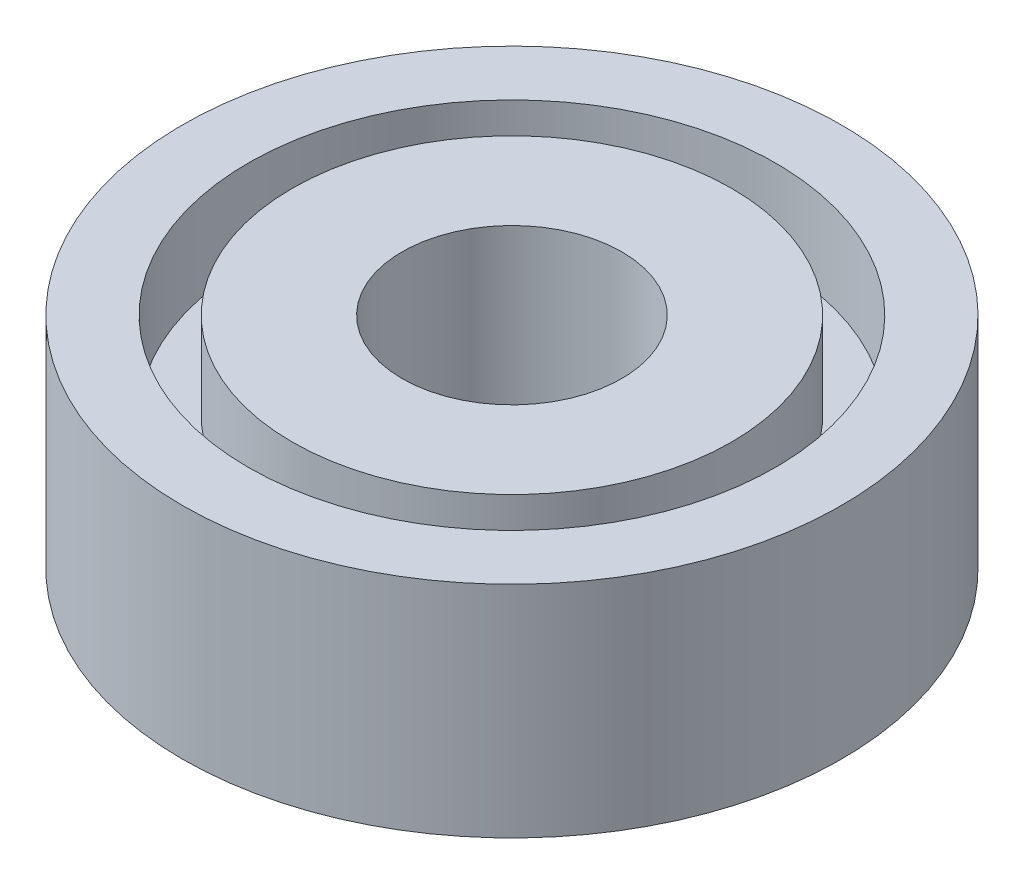
ISO-10303-21;
HEADER;
FILE_DESCRIPTION(('STEP AP214'),'2;1');
FILE_NAME('part.step','',(''),(''),'','','');
FILE_SCHEMA(('AUTOMOTIVE_DESIGN { 1 0 10303 214 1 1 1 1 }'));
ENDSEC;
DATA;
#1=APPLICATION_CONTEXT('core data for automotive mechanical design processes');
#2=APPLICATION_PROTOCOL_DEFINITION('international standard','automotive_design',2000,#1);
#3=PRODUCT_CONTEXT('',#1,'mechanical');
#4=PRODUCT('Part','Part','',(#3));
#5=PRODUCT_RELATED_PRODUCT_CATEGORY('part','',(#4));
#6=PRODUCT_DEFINITION_FORMATION('','',#4);
#7=PRODUCT_DEFINITION_CONTEXT('part definition',#1,'design');
#8=PRODUCT_DEFINITION('design','',#6,#7);
#9=PRODUCT_DEFINITION_SHAPE('','',#8);
#10=(LENGTH_UNIT() NAMED_UNIT(*) SI_UNIT(.MILLI.,.METRE.));
#11=(NAMED_UNIT(*) PLANE_ANGLE_UNIT() SI_UNIT($,.RADIAN.));
#12=(NAMED_UNIT(*) SI_UNIT($,.STERADIAN.) SOLID_ANGLE_UNIT());
#13=UNCERTAINTY_MEASURE_WITH_UNIT(LENGTH_MEASURE(1.E-05),#10,'distance_accuracy_value','');
#14=(GEOMETRIC_REPRESENTATION_CONTEXT(3) GLOBAL_UNCERTAINTY_ASSIGNED_CONTEXT((#13)) GLOBAL_UNIT_ASSIGNED_CONTEXT((#10,
#11,#12)) REPRESENTATION_CONTEXT('',''));
#15=CARTESIAN_POINT('',(0.,0.,0.));
#16=DIRECTION('',(0.,0.,1.));
#17=DIRECTION('',(1.,0.,0.));
#18=AXIS2_PLACEMENT_3D('',#15,#16,#17);
#19=CARTESIAN_POINT('',(0.,1.,0.));
#20=DIRECTION('',(0.,1.,0.));
#21=DIRECTION('',(0.,0.,1.));
#22=AXIS2_PLACEMENT_3D('',#19,#20,#21);
#23=PLANE('',#22);
#24=CARTESIAN_POINT('',(0.,1.,0.));
#25=DIRECTION('',(0.,1.,0.));
#26=DIRECTION('',(0.,0.,1.));
#27=AXIS2_PLACEMENT_3D('',#24,#25,#26);
#28=CIRCLE('',#27,0.5);
#29=CARTESIAN_POINT('',(0.,1.,0.5));
#30=VERTEX_POINT('',#29);
#31=EDGE_CURVE('E68',#30,#30,#28,.T.);
#32=ORIENTED_EDGE('',*,*,#31,.F.);
#33=EDGE_LOOP('',(#32));
#34=FACE_BOUND('',#33,.T.);
#35=CARTESIAN_POINT('',(0.,1.,0.));
#36=DIRECTION('',(0.,1.,0.));
#37=DIRECTION('',(0.,0.,1.));
#38=AXIS2_PLACEMENT_3D('',#35,#36,#37);
#39=CIRCLE('',#38,1.);
#40=CARTESIAN_POINT('',(0.,1.,1.));
#41=VERTEX_POINT('',#40);
#42=EDGE_CURVE('E102',#41,#41,#39,.T.);
#43=ORIENTED_EDGE('',*,*,#42,.T.);
#44=EDGE_LOOP('',(#43));
#45=FACE_BOUND('',#44,.T.);
#46=ADVANCED_FACE('F55',(#34,#45),#23,.T.);
#47=CARTESIAN_POINT('',(0.,0.,0.));
#48=DIRECTION('',(0.,1.,0.));
#49=DIRECTION('',(0.,0.,1.));
#50=AXIS2_PLACEMENT_3D('',#47,#48,#49);
#51=PLANE('',#50);
#52=CARTESIAN_POINT('',(0.,0.,0.));
#53=DIRECTION('',(0.,1.,0.));
#54=DIRECTION('',(0.,0.,1.));
#55=AXIS2_PLACEMENT_3D('',#52,#53,#54);
#56=CIRCLE('',#55,0.5);
#57=CARTESIAN_POINT('',(0.,0.,0.5));
#58=VERTEX_POINT('',#57);
#59=EDGE_CURVE('E70',#58,#58,#56,.T.);
#60=ORIENTED_EDGE('',*,*,#59,.T.);
#61=EDGE_LOOP('',(#60));
#62=FACE_BOUND('',#61,.T.);
#63=CARTESIAN_POINT('',(0.,0.,0.));
#64=DIRECTION('',(0.,1.,0.));
#65=DIRECTION('',(0.,0.,1.));
#66=AXIS2_PLACEMENT_3D('',#63,#64,#65);
#67=CIRCLE('',#66,1.);
#68=CARTESIAN_POINT('',(0.,0.,1.));
#69=VERTEX_POINT('',#68);
#70=EDGE_CURVE('E86',#69,#69,#67,.T.);
#71=ORIENTED_EDGE('',*,*,#70,.F.);
#72=EDGE_LOOP('',(#71));
#73=FACE_BOUND('',#72,.T.);
#74=ADVANCED_FACE('F129',(#62,#73),#51,.F.);
#75=CARTESIAN_POINT('',(0.,1.,0.));
#76=DIRECTION('',(0.,1.,0.));
#77=DIRECTION('',(0.,0.,1.));
#78=AXIS2_PLACEMENT_3D('',#75,#76,#77);
#79=CIRCLE('',#78,1.2);
#80=CARTESIAN_POINT('',(0.,1.,1.2));
#81=VERTEX_POINT('',#80);
#82=EDGE_CURVE('E94',#81,#81,#79,.T.);
#83=ORIENTED_EDGE('',*,*,#82,.F.);
#84=EDGE_LOOP('',(#83));
#85=FACE_BOUND('',#84,.T.);
#86=CARTESIAN_POINT('',(0.,1.,0.));
#87=DIRECTION('',(0.,1.,0.));
#88=DIRECTION('',(0.,0.,1.));
#89=AXIS2_PLACEMENT_3D('',#86,#87,#88);
#90=CIRCLE('',#89,1.5);
#91=CARTESIAN_POINT('',(0.,1.,1.5));
#92=VERTEX_POINT('',#91);
#93=EDGE_CURVE('E11',#92,#92,#90,.T.);
#94=ORIENTED_EDGE('',*,*,#93,.T.);
#95=EDGE_LOOP('',(#94));
#96=FACE_BOUND('',#95,.T.);
#97=ADVANCED_FACE('F126',(#85,#96),#23,.T.);
#98=CARTESIAN_POINT('',(0.,0.,0.));
#99=DIRECTION('',(0.,1.,0.));
#100=DIRECTION('',(1.,0.,0.));
#101=AXIS2_PLACEMENT_3D('',#98,#99,#100);
#102=CIRCLE('',#101,1.2);
#103=CARTESIAN_POINT('',(1.2,0.,0.));
#104=VERTEX_POINT('',#103);
#105=EDGE_CURVE('E78',#104,#104,#102,.T.);
#106=ORIENTED_EDGE('',*,*,#105,.T.);
#107=EDGE_LOOP('',(#106));
#108=FACE_BOUND('',#107,.T.);
#109=CARTESIAN_POINT('',(0.,0.,0.));
#110=DIRECTION('',(0.,1.,0.));
#111=DIRECTION('',(0.,0.,1.));
#112=AXIS2_PLACEMENT_3D('',#109,#110,#111);
#113=CIRCLE('',#112,1.5);
#114=CARTESIAN_POINT('',(0.,0.,1.5));
#115=VERTEX_POINT('',#114);
#116=EDGE_CURVE('E59',#115,#115,#113,.T.);
#117=ORIENTED_EDGE('',*,*,#116,.F.);
#118=EDGE_LOOP('',(#117));
#119=FACE_BOUND('',#118,.T.);
#120=ADVANCED_FACE('F128',(#108,#119),#51,.F.);
#121=CARTESIAN_POINT('',(0.,1.,0.));
#122=DIRECTION('',(0.,-1.,0.));
#123=DIRECTION('',(0.,0.,-1.));
#124=AXIS2_PLACEMENT_3D('',#121,#122,#123);
#125=CYLINDRICAL_SURFACE('',#124,1.5);
#126=ORIENTED_EDGE('',*,*,#93,.F.);
#127=EDGE_LOOP('',(#126));
#128=FACE_BOUND('',#127,.T.);
#129=ORIENTED_EDGE('',*,*,#116,.T.);
#130=EDGE_LOOP('',(#129));
#131=FACE_BOUND('',#130,.T.);
#132=ADVANCED_FACE('F57',(#128,#131),#125,.T.);
#133=CARTESIAN_POINT('',(0.,1.,0.));
#134=DIRECTION('',(0.,-1.,0.));
#135=DIRECTION('',(0.,0.,-1.));
#136=AXIS2_PLACEMENT_3D('',#133,#134,#135);
#137=CYLINDRICAL_SURFACE('',#136,0.5);
#138=ORIENTED_EDGE('',*,*,#31,.T.);
#139=EDGE_LOOP('',(#138));
#140=FACE_BOUND('',#139,.T.);
#141=ORIENTED_EDGE('',*,*,#59,.F.);
#142=EDGE_LOOP('',(#141));
#143=FACE_BOUND('',#142,.T.);
#144=ADVANCED_FACE('F157',(#140,#143),#137,.F.);
#145=CARTESIAN_POINT('',(0.,0.4,0.));
#146=DIRECTION('',(0.,1.,0.));
#147=DIRECTION('',(0.,0.,1.));
#148=AXIS2_PLACEMENT_3D('',#145,#146,#147);
#149=PLANE('',#148);
#150=CARTESIAN_POINT('',(0.,0.4,0.));
#151=DIRECTION('',(0.,1.,0.));
#152=DIRECTION('',(1.,0.,0.));
#153=AXIS2_PLACEMENT_3D('',#150,#151,#152);
#154=CIRCLE('',#153,1.2);
#155=CARTESIAN_POINT('',(1.2,0.4,0.));
#156=VERTEX_POINT('',#155);
#157=EDGE_CURVE('E74',#156,#156,#154,.T.);
#158=ORIENTED_EDGE('',*,*,#157,.F.);
#159=EDGE_LOOP('',(#158));
#160=FACE_BOUND('',#159,.T.);
#161=CARTESIAN_POINT('',(0.,0.4,0.));
#162=DIRECTION('',(0.,1.,0.));
#163=DIRECTION('',(0.,0.,1.));
#164=AXIS2_PLACEMENT_3D('',#161,#162,#163);
#165=CIRCLE('',#164,1.);
#166=CARTESIAN_POINT('',(0.,0.4,1.));
#167=VERTEX_POINT('',#166);
#168=EDGE_CURVE('E82',#167,#167,#165,.T.);
#169=ORIENTED_EDGE('',*,*,#168,.T.);
#170=EDGE_LOOP('',(#169));
#171=FACE_BOUND('',#170,.T.);
#172=ADVANCED_FACE('F154',(#160,#171),#149,.F.);
#173=CARTESIAN_POINT('',(0.,0.4,0.));
#174=DIRECTION('',(0.,-1.,0.));
#175=DIRECTION('',(0.,0.,-1.));
#176=AXIS2_PLACEMENT_3D('',#173,#174,#175);
#177=CYLINDRICAL_SURFACE('',#176,1.2);
#178=ORIENTED_EDGE('',*,*,#157,.T.);
#179=EDGE_LOOP('',(#178));
#180=FACE_BOUND('',#179,.T.);
#181=ORIENTED_EDGE('',*,*,#105,.F.);
#182=EDGE_LOOP('',(#181));
#183=FACE_BOUND('',#182,.T.);
#184=ADVANCED_FACE('F152',(#180,#183),#177,.F.);
#185=CARTESIAN_POINT('',(0.,0.4,0.));
#186=DIRECTION('',(0.,-1.,0.));
#187=DIRECTION('',(0.,0.,-1.));
#188=AXIS2_PLACEMENT_3D('',#185,#186,#187);
#189=CYLINDRICAL_SURFACE('',#188,1.);
#190=ORIENTED_EDGE('',*,*,#168,.F.);
#191=EDGE_LOOP('',(#190));
#192=FACE_BOUND('',#191,.T.);
#193=ORIENTED_EDGE('',*,*,#70,.T.);
#194=EDGE_LOOP('',(#193));
#195=FACE_BOUND('',#194,.T.);
#196=ADVANCED_FACE('F122',(#192,#195),#189,.T.);
#197=CARTESIAN_POINT('',(0.,0.6,0.));
#198=DIRECTION('',(0.,1.,0.));
#199=DIRECTION('',(0.,0.,1.));
#200=AXIS2_PLACEMENT_3D('',#197,#198,#199);
#201=CYLINDRICAL_SURFACE('',#200,1.2);
#202=CARTESIAN_POINT('',(0.,0.6,0.));
#203=DIRECTION('',(0.,1.,0.));
#204=DIRECTION('',(0.,0.,1.));
#205=AXIS2_PLACEMENT_3D('',#202,#203,#204);
#206=CIRCLE('',#205,1.2);
#207=CARTESIAN_POINT('',(0.,0.6,1.2));
#208=VERTEX_POINT('',#207);
#209=EDGE_CURVE('E90',#208,#208,#206,.T.);
#210=ORIENTED_EDGE('',*,*,#209,.F.);
#211=EDGE_LOOP('',(#210));
#212=FACE_BOUND('',#211,.T.);
#213=ORIENTED_EDGE('',*,*,#82,.T.);
#214=EDGE_LOOP('',(#213));
#215=FACE_BOUND('',#214,.T.);
#216=ADVANCED_FACE('F116',(#212,#215),#201,.F.);
#217=CARTESIAN_POINT('',(0.,0.6,0.));
#218=DIRECTION('',(0.,1.,0.));
#219=DIRECTION('',(0.,0.,1.));
#220=AXIS2_PLACEMENT_3D('',#217,#218,#219);
#221=PLANE('',#220);
#222=CARTESIAN_POINT('',(0.,0.6,0.));
#223=DIRECTION('',(0.,1.,0.));
#224=DIRECTION('',(0.,0.,1.));
#225=AXIS2_PLACEMENT_3D('',#222,#223,#224);
#226=CIRCLE('',#225,1.);
#227=CARTESIAN_POINT('',(0.,0.6,1.));
#228=VERTEX_POINT('',#227);
#229=EDGE_CURVE('E98',#228,#228,#226,.T.);
#230=ORIENTED_EDGE('',*,*,#229,.F.);
#231=EDGE_LOOP('',(#230));
#232=FACE_BOUND('',#231,.T.);
#233=ORIENTED_EDGE('',*,*,#209,.T.);
#234=EDGE_LOOP('',(#233));
#235=FACE_BOUND('',#234,.T.);
#236=ADVANCED_FACE('F113',(#232,#235),#221,.T.);
#237=CARTESIAN_POINT('',(0.,0.6,0.));
#238=DIRECTION('',(0.,1.,0.));
#239=DIRECTION('',(0.,0.,1.));
#240=AXIS2_PLACEMENT_3D('',#237,#238,#239);
#241=CYLINDRICAL_SURFACE('',#240,1.);
#242=ORIENTED_EDGE('',*,*,#229,.T.);
#243=EDGE_LOOP('',(#242));
#244=FACE_BOUND('',#243,.T.);
#245=ORIENTED_EDGE('',*,*,#42,.F.);
#246=EDGE_LOOP('',(#245));
#247=FACE_BOUND('',#246,.T.);
#248=ADVANCED_FACE('F110',(#244,#247),#241,.T.);
#249=CLOSED_SHELL('',(#46,#74,#97,#120,#132,#144,#172,#184,#196,#216,#236,#248));
#250=MANIFOLD_SOLID_BREP('B2',#249);
#251=ADVANCED_BREP_SHAPE_REPRESENTATION('',(#18,#250),#14);
#252=SHAPE_DEFINITION_REPRESENTATION(#9,#251);
ENDSEC;
END-ISO-10303-21;
